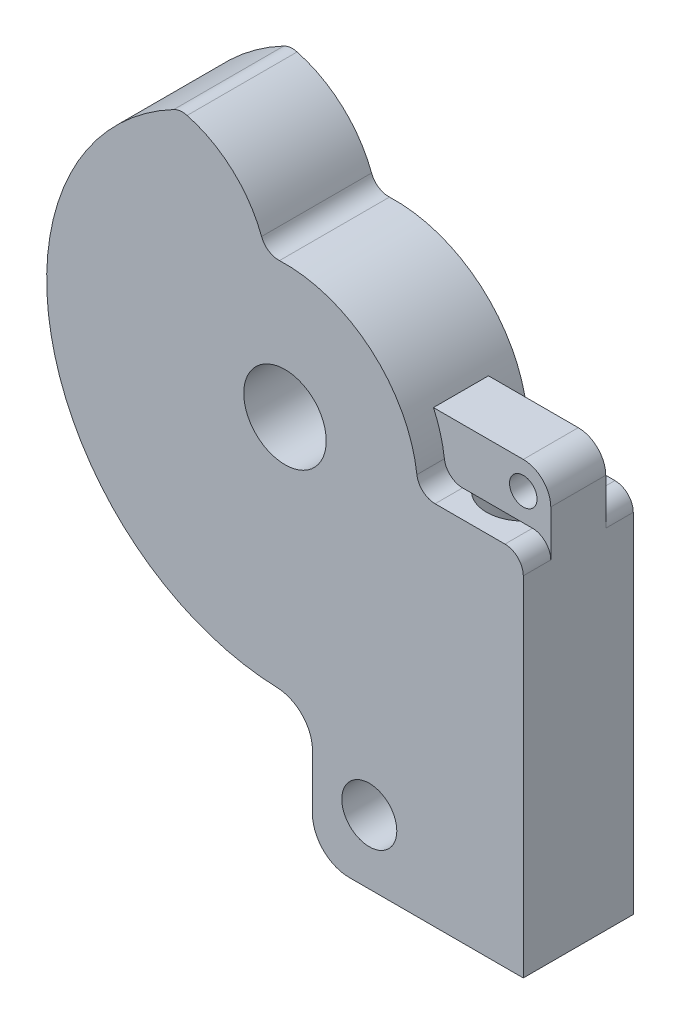
ISO-10303-21;
HEADER;
FILE_DESCRIPTION(('STEP AP214'),'2;1');
FILE_NAME('part.step','',(''),(''),'','','');
FILE_SCHEMA(('AUTOMOTIVE_DESIGN { 1 0 10303 214 1 1 1 1 }'));
ENDSEC;
DATA;
#1=APPLICATION_CONTEXT('core data for automotive mechanical design processes');
#2=APPLICATION_PROTOCOL_DEFINITION('international standard','automotive_design',2000,#1);
#3=PRODUCT_CONTEXT('',#1,'mechanical');
#4=PRODUCT('Part','Part','',(#3));
#5=PRODUCT_RELATED_PRODUCT_CATEGORY('part','',(#4));
#6=PRODUCT_DEFINITION_FORMATION('','',#4);
#7=PRODUCT_DEFINITION_CONTEXT('part definition',#1,'design');
#8=PRODUCT_DEFINITION('design','',#6,#7);
#9=PRODUCT_DEFINITION_SHAPE('','',#8);
#10=(LENGTH_UNIT() NAMED_UNIT(*) SI_UNIT(.MILLI.,.METRE.));
#11=(NAMED_UNIT(*) PLANE_ANGLE_UNIT() SI_UNIT($,.RADIAN.));
#12=(NAMED_UNIT(*) SI_UNIT($,.STERADIAN.) SOLID_ANGLE_UNIT());
#13=UNCERTAINTY_MEASURE_WITH_UNIT(LENGTH_MEASURE(1.E-05),#10,'distance_accuracy_value','');
#14=(GEOMETRIC_REPRESENTATION_CONTEXT(3) GLOBAL_UNCERTAINTY_ASSIGNED_CONTEXT((#13)) GLOBAL_UNIT_ASSIGNED_CONTEXT((#10,
#11,#12)) REPRESENTATION_CONTEXT('',''));
#15=CARTESIAN_POINT('',(0.,0.,0.));
#16=DIRECTION('',(0.,0.,1.));
#17=DIRECTION('',(1.,0.,0.));
#18=AXIS2_PLACEMENT_3D('',#15,#16,#17);
#19=CARTESIAN_POINT('',(13.,0.,-3.));
#20=DIRECTION('',(0.,-1.,0.));
#21=DIRECTION('',(1.,0.,0.));
#22=AXIS2_PLACEMENT_3D('',#19,#20,#21);
#23=PLANE('',#22);
#24=DIRECTION('',(1.,0.,0.));
#25=VECTOR('',#24,1.);
#26=CARTESIAN_POINT('',(7.25,0.,-1.5));
#27=LINE('',#26,#25);
#28=CARTESIAN_POINT('',(11.3228756555323,0.,-1.5));
#29=VERTEX_POINT('',#28);
#30=CARTESIAN_POINT('',(12.,0.,-1.5));
#31=VERTEX_POINT('',#30);
#32=EDGE_CURVE('E228',#29,#31,#27,.T.);
#33=ORIENTED_EDGE('',*,*,#32,.T.);
#34=DIRECTION('',(0.,0.,-1.));
#35=VECTOR('',#34,1.);
#36=CARTESIAN_POINT('',(12.,0.,-3.));
#37=LINE('',#36,#35);
#38=CARTESIAN_POINT('',(12.,0.,-3.));
#39=VERTEX_POINT('',#38);
#40=EDGE_CURVE('E303',#31,#39,#37,.T.);
#41=ORIENTED_EDGE('',*,*,#40,.T.);
#42=DIRECTION('',(1.,0.,0.));
#43=VECTOR('',#42,1.);
#44=CARTESIAN_POINT('',(13.,0.,-3.));
#45=LINE('',#44,#43);
#46=CARTESIAN_POINT('',(8.1891696770796,0.,-3.));
#47=VERTEX_POINT('',#46);
#48=EDGE_CURVE('E252',#47,#39,#45,.T.);
#49=ORIENTED_EDGE('',*,*,#48,.F.);
#50=DIRECTION('',(0.,0.,-1.));
#51=VECTOR('',#50,1.);
#52=CARTESIAN_POINT('',(8.1891696770796,0.,-1.5));
#53=LINE('',#52,#51);
#54=CARTESIAN_POINT('',(8.1891696770796,0.,-1.5));
#55=VERTEX_POINT('',#54);
#56=EDGE_CURVE('E300',#47,#55,#53,.F.);
#57=ORIENTED_EDGE('',*,*,#56,.T.);
#58=CARTESIAN_POINT('',(8.67712434446771,0.,-1.5));
#59=VERTEX_POINT('',#58);
#60=EDGE_CURVE('E230',#55,#59,#27,.T.);
#61=ORIENTED_EDGE('',*,*,#60,.T.);
#62=CARTESIAN_POINT('',(10.,0.,0.));
#63=DIRECTION('',(0.,-1.,0.));
#64=DIRECTION('',(1.,0.,0.));
#65=AXIS2_PLACEMENT_3D('',#62,#63,#64);
#66=CIRCLE('',#65,2.);
#67=EDGE_CURVE('E264',#29,#59,#66,.F.);
#68=ORIENTED_EDGE('',*,*,#67,.F.);
#69=EDGE_LOOP('',(#33,#41,#49,#57,#61,#68));
#70=FACE_BOUND('',#69,.T.);
#71=ADVANCED_FACE('F42',(#70),#23,.F.);
#72=CARTESIAN_POINT('',(0.,0.,3.));
#73=DIRECTION('',(0.,0.,1.));
#74=DIRECTION('',(1.,0.,0.));
#75=AXIS2_PLACEMENT_3D('',#72,#73,#74);
#76=PLANE('',#75);
#77=CARTESIAN_POINT('',(0.,0.,3.));
#78=DIRECTION('',(0.,0.,1.));
#79=DIRECTION('',(1.,0.,0.));
#80=AXIS2_PLACEMENT_3D('',#77,#78,#79);
#81=CIRCLE('',#80,2.25);
#82=CARTESIAN_POINT('',(2.25,0.,3.));
#83=VERTEX_POINT('',#82);
#84=EDGE_CURVE('E276',#83,#83,#81,.T.);
#85=ORIENTED_EDGE('',*,*,#84,.F.);
#86=EDGE_LOOP('',(#85));
#87=FACE_BOUND('',#86,.T.);
#88=DIRECTION('',(0.,1.,0.));
#89=VECTOR('',#88,1.);
#90=CARTESIAN_POINT('',(1.5,-20.,3.));
#91=LINE('',#90,#89);
#92=CARTESIAN_POINT('',(1.5,-18.,3.));
#93=VERTEX_POINT('',#92);
#94=CARTESIAN_POINT('',(1.5,-14.9916643505649,3.));
#95=VERTEX_POINT('',#94);
#96=EDGE_CURVE('E388',#93,#95,#91,.T.);
#97=ORIENTED_EDGE('',*,*,#96,.F.);
#98=CARTESIAN_POINT('',(3.5,-18.,3.));
#99=DIRECTION('',(0.,0.,1.));
#100=DIRECTION('',(1.,0.,0.));
#101=AXIS2_PLACEMENT_3D('',#98,#99,#100);
#102=CIRCLE('',#101,2.);
#103=CARTESIAN_POINT('',(3.5,-20.,3.));
#104=VERTEX_POINT('',#103);
#105=EDGE_CURVE('E57',#93,#104,#102,.T.);
#106=ORIENTED_EDGE('',*,*,#105,.T.);
#107=DIRECTION('',(1.,0.,0.));
#108=VECTOR('',#107,1.);
#109=CARTESIAN_POINT('',(13.,-20.,3.));
#110=LINE('',#109,#108);
#111=CARTESIAN_POINT('',(13.,-20.,3.));
#112=VERTEX_POINT('',#111);
#113=EDGE_CURVE('E286',#104,#112,#110,.T.);
#114=ORIENTED_EDGE('',*,*,#113,.T.);
#115=DIRECTION('',(0.,1.,0.));
#116=VECTOR('',#115,1.);
#117=CARTESIAN_POINT('',(13.,0.,3.));
#118=LINE('',#117,#116);
#119=CARTESIAN_POINT('',(13.,-0.999999999999997,3.));
#120=VERTEX_POINT('',#119);
#121=EDGE_CURVE('E289',#112,#120,#118,.T.);
#122=ORIENTED_EDGE('',*,*,#121,.T.);
#123=CARTESIAN_POINT('',(12.,-0.999999999999997,3.));
#124=DIRECTION('',(0.,0.,1.));
#125=DIRECTION('',(1.,0.,0.));
#126=AXIS2_PLACEMENT_3D('',#123,#124,#125);
#127=CIRCLE('',#126,1.);
#128=CARTESIAN_POINT('',(12.,0.,3.));
#129=VERTEX_POINT('',#128);
#130=EDGE_CURVE('E331',#120,#129,#127,.T.);
#131=ORIENTED_EDGE('',*,*,#130,.T.);
#132=DIRECTION('',(1.,0.,0.));
#133=VECTOR('',#132,1.);
#134=CARTESIAN_POINT('',(13.,0.,3.));
#135=LINE('',#134,#133);
#136=CARTESIAN_POINT('',(8.1891696770796,0.,3.));
#137=VERTEX_POINT('',#136);
#138=EDGE_CURVE('E249',#137,#129,#135,.T.);
#139=ORIENTED_EDGE('',*,*,#138,.F.);
#140=CARTESIAN_POINT('',(8.1891696770796,1.,3.));
#141=DIRECTION('',(0.,0.,1.));
#142=DIRECTION('',(1.,0.,0.));
#143=AXIS2_PLACEMENT_3D('',#140,#141,#142);
#144=CIRCLE('',#143,1.);
#145=CARTESIAN_POINT('',(7.1965430495548,0.878787878787879,3.));
#146=VERTEX_POINT('',#145);
#147=EDGE_CURVE('E344',#137,#146,#144,.F.);
#148=ORIENTED_EDGE('',*,*,#147,.T.);
#149=CARTESIAN_POINT('',(0.,0.,3.));
#150=DIRECTION('',(0.,0.,-1.));
#151=DIRECTION('',(1.,0.,0.));
#152=AXIS2_PLACEMENT_3D('',#149,#150,#151);
#153=CIRCLE('',#152,7.25);
#154=CARTESIAN_POINT('',(-0.29888319315225,7.24383661030887,3.));
#155=VERTEX_POINT('',#154);
#156=EDGE_CURVE('E259',#155,#146,#153,.T.);
#157=ORIENTED_EDGE('',*,*,#156,.F.);
#158=CARTESIAN_POINT('',(-0.34010846117325,8.24298648759285,3.));
#159=DIRECTION('',(0.,0.,1.));
#160=DIRECTION('',(1.,0.,0.));
#161=AXIS2_PLACEMENT_3D('',#158,#159,#160);
#162=CIRCLE('',#161,1.);
#163=CARTESIAN_POINT('',(-1.27643582215861,7.89185820181943,3.));
#164=VERTEX_POINT('',#163);
#165=EDGE_CURVE('E349',#155,#164,#162,.F.);
#166=ORIENTED_EDGE('',*,*,#165,.T.);
#167=CARTESIAN_POINT('',(-6.89439998807079,5.78508848717886,3.));
#168=DIRECTION('',(0.,0.,-1.));
#169=DIRECTION('',(1.,0.,0.));
#170=AXIS2_PLACEMENT_3D('',#167,#168,#169);
#171=CIRCLE('',#170,6.);
#172=CARTESIAN_POINT('',(-5.33895357475905,11.5799643663773,3.));
#173=VERTEX_POINT('',#172);
#174=EDGE_CURVE('E256',#173,#164,#171,.T.);
#175=ORIENTED_EDGE('',*,*,#174,.F.);
#176=CARTESIAN_POINT('',(-5.59819464364434,10.6141517198442,3.));
#177=DIRECTION('',(0.,0.,1.));
#178=DIRECTION('',(1.,0.,0.));
#179=AXIS2_PLACEMENT_3D('',#176,#177,#178);
#180=CIRCLE('',#179,1.);
#181=CARTESIAN_POINT('',(-6.06471086394803,11.4986643631646,3.));
#182=VERTEX_POINT('',#181);
#183=EDGE_CURVE('E329',#173,#182,#180,.T.);
#184=ORIENTED_EDGE('',*,*,#183,.T.);
#185=CARTESIAN_POINT('',(0.,0.,3.));
#186=DIRECTION('',(0.,0.,1.));
#187=DIRECTION('',(1.,0.,0.));
#188=AXIS2_PLACEMENT_3D('',#185,#186,#187);
#189=CIRCLE('',#188,13.);
#190=CARTESIAN_POINT('',(-0.433333333333332,-12.9927757704896,3.));
#191=VERTEX_POINT('',#190);
#192=EDGE_CURVE('E283',#182,#191,#189,.T.);
#193=ORIENTED_EDGE('',*,*,#192,.T.);
#194=CARTESIAN_POINT('',(-0.499999999999999,-14.9916643505649,3.));
#195=DIRECTION('',(0.,0.,1.));
#196=DIRECTION('',(1.,0.,0.));
#197=AXIS2_PLACEMENT_3D('',#194,#195,#196);
#198=CIRCLE('',#197,2.);
#199=EDGE_CURVE('E13',#191,#95,#198,.F.);
#200=ORIENTED_EDGE('',*,*,#199,.T.);
#201=EDGE_LOOP('',(#97,#106,#114,#122,#131,#139,#148,#157,#166,#175,#184,#193,#200));
#202=FACE_BOUND('',#201,.T.);
#203=CARTESIAN_POINT('',(4.6,-16.5,3.));
#204=DIRECTION('',(0.,0.,1.));
#205=DIRECTION('',(1.,0.,0.));
#206=AXIS2_PLACEMENT_3D('',#203,#204,#205);
#207=CIRCLE('',#206,1.5);
#208=CARTESIAN_POINT('',(6.1,-16.5,3.));
#209=VERTEX_POINT('',#208);
#210=EDGE_CURVE('E357',#209,#209,#207,.F.);
#211=ORIENTED_EDGE('',*,*,#210,.T.);
#212=EDGE_LOOP('',(#211));
#213=FACE_BOUND('',#212,.T.);
#214=ADVANCED_FACE('F386',(#87,#202,#213),#76,.T.);
#215=CARTESIAN_POINT('',(0.,0.,-3.));
#216=DIRECTION('',(0.,0.,1.));
#217=DIRECTION('',(1.,0.,0.));
#218=AXIS2_PLACEMENT_3D('',#215,#216,#217);
#219=PLANE('',#218);
#220=CARTESIAN_POINT('',(-6.89439998807079,5.78508848717886,-3.));
#221=DIRECTION('',(0.,0.,1.));
#222=DIRECTION('',(1.,0.,0.));
#223=AXIS2_PLACEMENT_3D('',#220,#221,#222);
#224=CIRCLE('',#223,3.);
#225=CARTESIAN_POINT('',(-3.89439998807079,5.78508848717886,-3.));
#226=VERTEX_POINT('',#225);
#227=EDGE_CURVE('E267',#226,#226,#224,.T.);
#228=ORIENTED_EDGE('',*,*,#227,.T.);
#229=EDGE_LOOP('',(#228));
#230=FACE_BOUND('',#229,.T.);
#231=CARTESIAN_POINT('',(0.,0.,-3.));
#232=DIRECTION('',(0.,0.,1.));
#233=DIRECTION('',(1.,0.,0.));
#234=AXIS2_PLACEMENT_3D('',#231,#232,#233);
#235=CIRCLE('',#234,2.25);
#236=CARTESIAN_POINT('',(2.25,0.,-3.));
#237=VERTEX_POINT('',#236);
#238=EDGE_CURVE('E279',#237,#237,#235,.T.);
#239=ORIENTED_EDGE('',*,*,#238,.T.);
#240=EDGE_LOOP('',(#239));
#241=FACE_BOUND('',#240,.T.);
#242=DIRECTION('',(1.,0.,0.));
#243=VECTOR('',#242,1.);
#244=CARTESIAN_POINT('',(13.,-20.,-3.));
#245=LINE('',#244,#243);
#246=CARTESIAN_POINT('',(3.5,-20.,-3.));
#247=VERTEX_POINT('',#246);
#248=CARTESIAN_POINT('',(13.,-20.,-3.));
#249=VERTEX_POINT('',#248);
#250=EDGE_CURVE('E295',#247,#249,#245,.T.);
#251=ORIENTED_EDGE('',*,*,#250,.F.);
#252=CARTESIAN_POINT('',(3.5,-18.,-3.));
#253=DIRECTION('',(0.,0.,1.));
#254=DIRECTION('',(1.,0.,0.));
#255=AXIS2_PLACEMENT_3D('',#252,#253,#254);
#256=CIRCLE('',#255,2.);
#257=CARTESIAN_POINT('',(1.5,-18.,-3.));
#258=VERTEX_POINT('',#257);
#259=EDGE_CURVE('E65',#247,#258,#256,.F.);
#260=ORIENTED_EDGE('',*,*,#259,.T.);
#261=DIRECTION('',(0.,1.,0.));
#262=VECTOR('',#261,1.);
#263=CARTESIAN_POINT('',(1.5,-20.,-3.));
#264=LINE('',#263,#262);
#265=CARTESIAN_POINT('',(1.5,-14.9916643505649,-3.));
#266=VERTEX_POINT('',#265);
#267=EDGE_CURVE('E375',#258,#266,#264,.T.);
#268=ORIENTED_EDGE('',*,*,#267,.T.);
#269=CARTESIAN_POINT('',(-0.499999999999999,-14.9916643505649,-3.));
#270=DIRECTION('',(0.,0.,1.));
#271=DIRECTION('',(1.,0.,0.));
#272=AXIS2_PLACEMENT_3D('',#269,#270,#271);
#273=CIRCLE('',#272,2.);
#274=CARTESIAN_POINT('',(-0.433333333333332,-12.9927757704896,-3.));
#275=VERTEX_POINT('',#274);
#276=EDGE_CURVE('E50',#266,#275,#273,.T.);
#277=ORIENTED_EDGE('',*,*,#276,.T.);
#278=CARTESIAN_POINT('',(0.,0.,-3.));
#279=DIRECTION('',(0.,0.,1.));
#280=DIRECTION('',(1.,0.,0.));
#281=AXIS2_PLACEMENT_3D('',#278,#279,#280);
#282=CIRCLE('',#281,13.);
#283=CARTESIAN_POINT('',(-6.06471086394803,11.4986643631646,-3.));
#284=VERTEX_POINT('',#283);
#285=EDGE_CURVE('E282',#284,#275,#282,.T.);
#286=ORIENTED_EDGE('',*,*,#285,.F.);
#287=CARTESIAN_POINT('',(-5.59819464364434,10.6141517198442,-3.));
#288=DIRECTION('',(0.,0.,1.));
#289=DIRECTION('',(1.,0.,0.));
#290=AXIS2_PLACEMENT_3D('',#287,#288,#289);
#291=CIRCLE('',#290,1.);
#292=CARTESIAN_POINT('',(-5.33895357475905,11.5799643663773,-3.));
#293=VERTEX_POINT('',#292);
#294=EDGE_CURVE('E306',#284,#293,#291,.F.);
#295=ORIENTED_EDGE('',*,*,#294,.T.);
#296=CARTESIAN_POINT('',(-6.89439998807079,5.78508848717886,-3.));
#297=DIRECTION('',(0.,0.,-1.));
#298=DIRECTION('',(1.,0.,0.));
#299=AXIS2_PLACEMENT_3D('',#296,#297,#298);
#300=CIRCLE('',#299,6.);
#301=CARTESIAN_POINT('',(-1.27643582215861,7.89185820181943,-3.));
#302=VERTEX_POINT('',#301);
#303=EDGE_CURVE('E245',#293,#302,#300,.T.);
#304=ORIENTED_EDGE('',*,*,#303,.T.);
#305=CARTESIAN_POINT('',(-0.34010846117325,8.24298648759285,-3.));
#306=DIRECTION('',(0.,0.,1.));
#307=DIRECTION('',(1.,0.,0.));
#308=AXIS2_PLACEMENT_3D('',#305,#306,#307);
#309=CIRCLE('',#308,1.);
#310=CARTESIAN_POINT('',(-0.29888319315225,7.24383661030887,-3.));
#311=VERTEX_POINT('',#310);
#312=EDGE_CURVE('E351',#302,#311,#309,.T.);
#313=ORIENTED_EDGE('',*,*,#312,.T.);
#314=CARTESIAN_POINT('',(0.,0.,-3.));
#315=DIRECTION('',(0.,0.,-1.));
#316=DIRECTION('',(1.,0.,0.));
#317=AXIS2_PLACEMENT_3D('',#314,#315,#316);
#318=CIRCLE('',#317,7.25);
#319=CARTESIAN_POINT('',(7.1965430495548,0.878787878787879,-3.));
#320=VERTEX_POINT('',#319);
#321=EDGE_CURVE('E248',#311,#320,#318,.T.);
#322=ORIENTED_EDGE('',*,*,#321,.T.);
#323=CARTESIAN_POINT('',(8.1891696770796,1.,-3.));
#324=DIRECTION('',(0.,0.,1.));
#325=DIRECTION('',(1.,0.,0.));
#326=AXIS2_PLACEMENT_3D('',#323,#324,#325);
#327=CIRCLE('',#326,1.);
#328=EDGE_CURVE('E347',#320,#47,#327,.T.);
#329=ORIENTED_EDGE('',*,*,#328,.T.);
#330=ORIENTED_EDGE('',*,*,#48,.T.);
#331=CARTESIAN_POINT('',(12.,-0.999999999999997,-3.));
#332=DIRECTION('',(0.,0.,1.));
#333=DIRECTION('',(1.,0.,0.));
#334=AXIS2_PLACEMENT_3D('',#331,#332,#333);
#335=CIRCLE('',#334,1.);
#336=CARTESIAN_POINT('',(13.,-0.999999999999997,-3.));
#337=VERTEX_POINT('',#336);
#338=EDGE_CURVE('E308',#39,#337,#335,.F.);
#339=ORIENTED_EDGE('',*,*,#338,.T.);
#340=DIRECTION('',(0.,1.,0.));
#341=VECTOR('',#340,1.);
#342=CARTESIAN_POINT('',(13.,0.,-3.));
#343=LINE('',#342,#341);
#344=EDGE_CURVE('E287',#249,#337,#343,.T.);
#345=ORIENTED_EDGE('',*,*,#344,.F.);
#346=EDGE_LOOP('',(#251,#260,#268,#277,#286,#295,#304,#313,#322,#329,#330,#339,#345));
#347=FACE_BOUND('',#346,.T.);
#348=CARTESIAN_POINT('',(4.6,-16.5,-3.));
#349=DIRECTION('',(0.,0.,-1.));
#350=DIRECTION('',(-1.,0.,0.));
#351=AXIS2_PLACEMENT_3D('',#348,#349,#350);
#352=CIRCLE('',#351,1.5);
#353=CARTESIAN_POINT('',(3.1,-16.5,-3.));
#354=VERTEX_POINT('',#353);
#355=EDGE_CURVE('E391',#354,#354,#352,.T.);
#356=ORIENTED_EDGE('',*,*,#355,.F.);
#357=EDGE_LOOP('',(#356));
#358=FACE_BOUND('',#357,.T.);
#359=ADVANCED_FACE('F371',(#230,#241,#347,#358),#219,.F.);
#360=CARTESIAN_POINT('',(0.,0.,3.));
#361=DIRECTION('',(0.,0.,-1.));
#362=DIRECTION('',(-1.,0.,0.));
#363=AXIS2_PLACEMENT_3D('',#360,#361,#362);
#364=CYLINDRICAL_SURFACE('',#363,13.);
#365=ORIENTED_EDGE('',*,*,#285,.T.);
#366=DIRECTION('',(0.,0.,-1.));
#367=VECTOR('',#366,1.);
#368=CARTESIAN_POINT('',(-0.433333333333332,-12.9927757704896,3.));
#369=LINE('',#368,#367);
#370=EDGE_CURVE('E362',#275,#191,#369,.F.);
#371=ORIENTED_EDGE('',*,*,#370,.T.);
#372=ORIENTED_EDGE('',*,*,#192,.F.);
#373=DIRECTION('',(0.,0.,-1.));
#374=VECTOR('',#373,1.);
#375=CARTESIAN_POINT('',(-6.06471086394803,11.4986643631646,3.));
#376=LINE('',#375,#374);
#377=EDGE_CURVE('E340',#182,#284,#376,.T.);
#378=ORIENTED_EDGE('',*,*,#377,.T.);
#379=EDGE_LOOP('',(#365,#371,#372,#378));
#380=FACE_BOUND('',#379,.T.);
#381=ADVANCED_FACE('F380',(#380),#364,.T.);
#382=CARTESIAN_POINT('',(13.,-20.,3.));
#383=DIRECTION('',(0.,1.,0.));
#384=DIRECTION('',(0.,0.,1.));
#385=AXIS2_PLACEMENT_3D('',#382,#383,#384);
#386=PLANE('',#385);
#387=CARTESIAN_POINT('',(10.,-20.,0.));
#388=DIRECTION('',(0.,-1.,0.));
#389=DIRECTION('',(0.,0.,-1.));
#390=AXIS2_PLACEMENT_3D('',#387,#388,#389);
#391=CIRCLE('',#390,2.);
#392=CARTESIAN_POINT('',(10.,-20.,-2.));
#393=VERTEX_POINT('',#392);
#394=EDGE_CURVE('E273',#393,#393,#391,.T.);
#395=ORIENTED_EDGE('',*,*,#394,.F.);
#396=EDGE_LOOP('',(#395));
#397=FACE_BOUND('',#396,.T.);
#398=ORIENTED_EDGE('',*,*,#113,.F.);
#399=DIRECTION('',(0.,0.,-1.));
#400=VECTOR('',#399,1.);
#401=CARTESIAN_POINT('',(3.5,-20.,-3.));
#402=LINE('',#401,#400);
#403=EDGE_CURVE('E364',#104,#247,#402,.T.);
#404=ORIENTED_EDGE('',*,*,#403,.T.);
#405=ORIENTED_EDGE('',*,*,#250,.T.);
#406=DIRECTION('',(0.,0.,-1.));
#407=VECTOR('',#406,1.);
#408=CARTESIAN_POINT('',(13.,-20.,3.));
#409=LINE('',#408,#407);
#410=EDGE_CURVE('E292',#112,#249,#409,.T.);
#411=ORIENTED_EDGE('',*,*,#410,.F.);
#412=EDGE_LOOP('',(#398,#404,#405,#411));
#413=FACE_BOUND('',#412,.T.);
#414=ADVANCED_FACE('F434',(#397,#413),#386,.F.);
#415=CARTESIAN_POINT('',(13.,0.,3.));
#416=DIRECTION('',(-1.,0.,0.));
#417=DIRECTION('',(0.,-1.,0.));
#418=AXIS2_PLACEMENT_3D('',#415,#416,#417);
#419=PLANE('',#418);
#420=ORIENTED_EDGE('',*,*,#344,.T.);
#421=DIRECTION('',(0.,0.,-1.));
#422=VECTOR('',#421,1.);
#423=CARTESIAN_POINT('',(13.,-0.999999999999997,3.));
#424=LINE('',#423,#422);
#425=CARTESIAN_POINT('',(13.,-0.999999999999997,-1.5));
#426=VERTEX_POINT('',#425);
#427=EDGE_CURVE('E312',#337,#426,#424,.F.);
#428=ORIENTED_EDGE('',*,*,#427,.T.);
#429=DIRECTION('',(0.,1.,0.));
#430=VECTOR('',#429,1.);
#431=CARTESIAN_POINT('',(13.,1.5,-1.5));
#432=LINE('',#431,#430);
#433=CARTESIAN_POINT('',(13.,1.5,-1.5));
#434=VERTEX_POINT('',#433);
#435=EDGE_CURVE('E210',#426,#434,#432,.T.);
#436=ORIENTED_EDGE('',*,*,#435,.T.);
#437=DIRECTION('',(0.,0.,-1.));
#438=VECTOR('',#437,1.);
#439=CARTESIAN_POINT('',(13.,1.5,1.5));
#440=LINE('',#439,#438);
#441=CARTESIAN_POINT('',(13.,1.5,1.5));
#442=VERTEX_POINT('',#441);
#443=EDGE_CURVE('E206',#442,#434,#440,.T.);
#444=ORIENTED_EDGE('',*,*,#443,.F.);
#445=DIRECTION('',(0.,1.,0.));
#446=VECTOR('',#445,1.);
#447=CARTESIAN_POINT('',(13.,1.5,1.5));
#448=LINE('',#447,#446);
#449=CARTESIAN_POINT('',(13.,-0.999999999999997,1.5));
#450=VERTEX_POINT('',#449);
#451=EDGE_CURVE('E191',#450,#442,#448,.T.);
#452=ORIENTED_EDGE('',*,*,#451,.F.);
#453=DIRECTION('',(0.,0.,-1.));
#454=VECTOR('',#453,1.);
#455=CARTESIAN_POINT('',(13.,-0.999999999999997,3.));
#456=LINE('',#455,#454);
#457=EDGE_CURVE('E310',#450,#120,#456,.F.);
#458=ORIENTED_EDGE('',*,*,#457,.T.);
#459=ORIENTED_EDGE('',*,*,#121,.F.);
#460=ORIENTED_EDGE('',*,*,#410,.T.);
#461=EDGE_LOOP('',(#420,#428,#436,#444,#452,#458,#459,#460));
#462=FACE_BOUND('',#461,.T.);
#463=ADVANCED_FACE('F208',(#462),#419,.F.);
#464=CARTESIAN_POINT('',(0.,0.,3.));
#465=DIRECTION('',(0.,0.,1.));
#466=DIRECTION('',(1.,0.,0.));
#467=AXIS2_PLACEMENT_3D('',#464,#465,#466);
#468=CYLINDRICAL_SURFACE('',#467,2.25);
#469=ORIENTED_EDGE('',*,*,#238,.F.);
#470=EDGE_LOOP('',(#469));
#471=FACE_BOUND('',#470,.T.);
#472=ORIENTED_EDGE('',*,*,#84,.T.);
#473=EDGE_LOOP('',(#472));
#474=FACE_BOUND('',#473,.T.);
#475=ADVANCED_FACE('F472',(#471,#474),#468,.F.);
#476=CARTESIAN_POINT('',(10.,0.,0.));
#477=DIRECTION('',(0.,-1.,0.));
#478=DIRECTION('',(0.,0.,-1.));
#479=AXIS2_PLACEMENT_3D('',#476,#477,#478);
#480=CYLINDRICAL_SURFACE('',#479,2.);
#481=ORIENTED_EDGE('',*,*,#67,.T.);
#482=CARTESIAN_POINT('',(10.,0.,0.));
#483=DIRECTION('',(0.,1.,0.));
#484=DIRECTION('',(-1.,0.,0.));
#485=AXIS2_PLACEMENT_3D('',#482,#483,#484);
#486=CIRCLE('',#485,2.);
#487=CARTESIAN_POINT('',(8.6771243444677,0.,1.5));
#488=VERTEX_POINT('',#487);
#489=EDGE_CURVE('E213',#488,#59,#486,.F.);
#490=ORIENTED_EDGE('',*,*,#489,.F.);
#491=CARTESIAN_POINT('',(11.3228756555323,0.,1.5));
#492=VERTEX_POINT('',#491);
#493=EDGE_CURVE('E255',#488,#492,#66,.F.);
#494=ORIENTED_EDGE('',*,*,#493,.T.);
#495=EDGE_CURVE('E244',#29,#492,#486,.F.);
#496=ORIENTED_EDGE('',*,*,#495,.F.);
#497=EDGE_LOOP('',(#481,#490,#494,#496));
#498=FACE_BOUND('',#497,.T.);
#499=ORIENTED_EDGE('',*,*,#394,.T.);
#500=EDGE_LOOP('',(#499));
#501=FACE_BOUND('',#500,.T.);
#502=ADVANCED_FACE('F413',(#498,#501),#480,.F.);
#503=CARTESIAN_POINT('',(-6.89439998807079,5.78508848717886,11.4852813742386));
#504=DIRECTION('',(0.,0.,-1.));
#505=DIRECTION('',(-1.,0.,0.));
#506=AXIS2_PLACEMENT_3D('',#503,#504,#505);
#507=CYLINDRICAL_SURFACE('',#506,3.);
#508=ORIENTED_EDGE('',*,*,#227,.F.);
#509=EDGE_LOOP('',(#508));
#510=FACE_BOUND('',#509,.T.);
#511=CARTESIAN_POINT('',(-6.89439998807079,5.78508848717886,1.4));
#512=DIRECTION('',(0.,0.,1.));
#513=DIRECTION('',(1.,0.,0.));
#514=AXIS2_PLACEMENT_3D('',#511,#512,#513);
#515=CIRCLE('',#514,3.);
#516=CARTESIAN_POINT('',(-3.89439998807079,5.78508848717886,1.4));
#517=VERTEX_POINT('',#516);
#518=EDGE_CURVE('E270',#517,#517,#515,.T.);
#519=ORIENTED_EDGE('',*,*,#518,.T.);
#520=EDGE_LOOP('',(#519));
#521=FACE_BOUND('',#520,.T.);
#522=ADVANCED_FACE('F459',(#510,#521),#507,.F.);
#523=CARTESIAN_POINT('',(0.,0.,1.4));
#524=DIRECTION('',(0.,0.,1.));
#525=DIRECTION('',(1.,0.,0.));
#526=AXIS2_PLACEMENT_3D('',#523,#524,#525);
#527=PLANE('',#526);
#528=ORIENTED_EDGE('',*,*,#518,.F.);
#529=EDGE_LOOP('',(#528));
#530=FACE_BOUND('',#529,.T.);
#531=ADVANCED_FACE('F452',(#530),#527,.F.);
#532=DIRECTION('',(1.,0.,0.));
#533=VECTOR('',#532,1.);
#534=CARTESIAN_POINT('',(7.25,0.,1.5));
#535=LINE('',#534,#533);
#536=CARTESIAN_POINT('',(8.1891696770796,0.,1.5));
#537=VERTEX_POINT('',#536);
#538=EDGE_CURVE('E203',#537,#488,#535,.T.);
#539=ORIENTED_EDGE('',*,*,#538,.F.);
#540=DIRECTION('',(0.,0.,-1.));
#541=VECTOR('',#540,1.);
#542=CARTESIAN_POINT('',(8.1891696770796,0.,3.));
#543=LINE('',#542,#541);
#544=EDGE_CURVE('E317',#537,#137,#543,.F.);
#545=ORIENTED_EDGE('',*,*,#544,.T.);
#546=ORIENTED_EDGE('',*,*,#138,.T.);
#547=DIRECTION('',(0.,0.,-1.));
#548=VECTOR('',#547,1.);
#549=CARTESIAN_POINT('',(12.,0.,-3.));
#550=LINE('',#549,#548);
#551=CARTESIAN_POINT('',(12.,0.,1.5));
#552=VERTEX_POINT('',#551);
#553=EDGE_CURVE('E314',#129,#552,#550,.T.);
#554=ORIENTED_EDGE('',*,*,#553,.T.);
#555=EDGE_CURVE('E399',#492,#552,#535,.T.);
#556=ORIENTED_EDGE('',*,*,#555,.F.);
#557=ORIENTED_EDGE('',*,*,#493,.F.);
#558=EDGE_LOOP('',(#539,#545,#546,#554,#556,#557));
#559=FACE_BOUND('',#558,.T.);
#560=ADVANCED_FACE('F407',(#559),#23,.F.);
#561=CARTESIAN_POINT('',(0.,0.,-3.));
#562=DIRECTION('',(0.,0.,1.));
#563=DIRECTION('',(1.,0.,0.));
#564=AXIS2_PLACEMENT_3D('',#561,#562,#563);
#565=CYLINDRICAL_SURFACE('',#564,7.25);
#566=ORIENTED_EDGE('',*,*,#156,.T.);
#567=DIRECTION('',(0.,0.,1.));
#568=VECTOR('',#567,1.);
#569=CARTESIAN_POINT('',(7.1965430495548,0.878787878787878,-3.));
#570=LINE('',#569,#568);
#571=CARTESIAN_POINT('',(7.1965430495548,0.878787878787879,1.5));
#572=VERTEX_POINT('',#571);
#573=EDGE_CURVE('E325',#146,#572,#570,.F.);
#574=ORIENTED_EDGE('',*,*,#573,.T.);
#575=CARTESIAN_POINT('',(0.,0.,1.5));
#576=DIRECTION('',(0.,0.,-1.));
#577=DIRECTION('',(1.,0.,0.));
#578=AXIS2_PLACEMENT_3D('',#575,#576,#577);
#579=CIRCLE('',#578,7.25);
#580=CARTESIAN_POINT('',(6.60018939122204,3.,1.5));
#581=VERTEX_POINT('',#580);
#582=EDGE_CURVE('E239',#581,#572,#579,.T.);
#583=ORIENTED_EDGE('',*,*,#582,.F.);
#584=DIRECTION('',(0.,0.,-1.));
#585=VECTOR('',#584,1.);
#586=CARTESIAN_POINT('',(6.60018939122204,3.,1.5));
#587=LINE('',#586,#585);
#588=CARTESIAN_POINT('',(6.60018939122204,3.,-1.5));
#589=VERTEX_POINT('',#588);
#590=EDGE_CURVE('E221',#581,#589,#587,.T.);
#591=ORIENTED_EDGE('',*,*,#590,.T.);
#592=CARTESIAN_POINT('',(0.,0.,-1.5));
#593=DIRECTION('',(0.,0.,-1.));
#594=DIRECTION('',(1.,0.,0.));
#595=AXIS2_PLACEMENT_3D('',#592,#593,#594);
#596=CIRCLE('',#595,7.25);
#597=CARTESIAN_POINT('',(7.1965430495548,0.878787878787879,-1.5));
#598=VERTEX_POINT('',#597);
#599=EDGE_CURVE('E225',#589,#598,#596,.T.);
#600=ORIENTED_EDGE('',*,*,#599,.T.);
#601=DIRECTION('',(0.,0.,1.));
#602=VECTOR('',#601,1.);
#603=CARTESIAN_POINT('',(7.1965430495548,0.878787878787878,-3.));
#604=LINE('',#603,#602);
#605=EDGE_CURVE('E323',#598,#320,#604,.F.);
#606=ORIENTED_EDGE('',*,*,#605,.T.);
#607=ORIENTED_EDGE('',*,*,#321,.F.);
#608=DIRECTION('',(0.,0.,1.));
#609=VECTOR('',#608,1.);
#610=CARTESIAN_POINT('',(-0.29888319315225,7.24383661030887,-3.));
#611=LINE('',#610,#609);
#612=EDGE_CURVE('E320',#311,#155,#611,.T.);
#613=ORIENTED_EDGE('',*,*,#612,.T.);
#614=EDGE_LOOP('',(#566,#574,#583,#591,#600,#606,#607,#613));
#615=FACE_BOUND('',#614,.T.);
#616=ADVANCED_FACE('F451',(#615),#565,.T.);
#617=CARTESIAN_POINT('',(-6.89439998807079,5.78508848717886,-3.));
#618=DIRECTION('',(0.,0.,1.));
#619=DIRECTION('',(1.,0.,0.));
#620=AXIS2_PLACEMENT_3D('',#617,#618,#619);
#621=CYLINDRICAL_SURFACE('',#620,6.);
#622=ORIENTED_EDGE('',*,*,#174,.T.);
#623=DIRECTION('',(0.,0.,1.));
#624=VECTOR('',#623,1.);
#625=CARTESIAN_POINT('',(-1.27643582215861,7.89185820181943,-3.));
#626=LINE('',#625,#624);
#627=EDGE_CURVE('E338',#164,#302,#626,.F.);
#628=ORIENTED_EDGE('',*,*,#627,.T.);
#629=ORIENTED_EDGE('',*,*,#303,.F.);
#630=DIRECTION('',(0.,0.,1.));
#631=VECTOR('',#630,1.);
#632=CARTESIAN_POINT('',(-5.33895357475905,11.5799643663773,-3.));
#633=LINE('',#632,#631);
#634=EDGE_CURVE('E335',#293,#173,#633,.T.);
#635=ORIENTED_EDGE('',*,*,#634,.T.);
#636=EDGE_LOOP('',(#622,#628,#629,#635));
#637=FACE_BOUND('',#636,.T.);
#638=ADVANCED_FACE('F457',(#637),#621,.T.);
#639=CARTESIAN_POINT('',(7.25,0.,1.5));
#640=DIRECTION('',(0.,1.,0.));
#641=DIRECTION('',(-1.,0.,0.));
#642=AXIS2_PLACEMENT_3D('',#639,#640,#641);
#643=PLANE('',#642);
#644=EDGE_CURVE('E232',#59,#29,#27,.T.);
#645=ORIENTED_EDGE('',*,*,#644,.T.);
#646=ORIENTED_EDGE('',*,*,#495,.T.);
#647=EDGE_CURVE('E400',#488,#492,#535,.T.);
#648=ORIENTED_EDGE('',*,*,#647,.F.);
#649=ORIENTED_EDGE('',*,*,#489,.T.);
#650=EDGE_LOOP('',(#645,#646,#648,#649));
#651=FACE_BOUND('',#650,.T.);
#652=ADVANCED_FACE('F418',(#651),#643,.F.);
#653=CARTESIAN_POINT('',(11.5,1.5,1.5));
#654=DIRECTION('',(0.,0.,-1.));
#655=DIRECTION('',(-1.,0.,0.));
#656=AXIS2_PLACEMENT_3D('',#653,#654,#655);
#657=CYLINDRICAL_SURFACE('',#656,1.5);
#658=CARTESIAN_POINT('',(11.5,1.5,-1.5));
#659=DIRECTION('',(0.,0.,1.));
#660=DIRECTION('',(1.,0.,0.));
#661=AXIS2_PLACEMENT_3D('',#658,#659,#660);
#662=CIRCLE('',#661,1.5);
#663=CARTESIAN_POINT('',(11.5,3.,-1.5));
#664=VERTEX_POINT('',#663);
#665=EDGE_CURVE('E234',#434,#664,#662,.T.);
#666=ORIENTED_EDGE('',*,*,#665,.T.);
#667=DIRECTION('',(0.,0.,-1.));
#668=VECTOR('',#667,1.);
#669=CARTESIAN_POINT('',(11.5,3.,1.5));
#670=LINE('',#669,#668);
#671=CARTESIAN_POINT('',(11.5,3.,1.5));
#672=VERTEX_POINT('',#671);
#673=EDGE_CURVE('E214',#672,#664,#670,.T.);
#674=ORIENTED_EDGE('',*,*,#673,.F.);
#675=CARTESIAN_POINT('',(11.5,1.5,1.5));
#676=DIRECTION('',(0.,0.,1.));
#677=DIRECTION('',(1.,0.,0.));
#678=AXIS2_PLACEMENT_3D('',#675,#676,#677);
#679=CIRCLE('',#678,1.5);
#680=EDGE_CURVE('E197',#442,#672,#679,.T.);
#681=ORIENTED_EDGE('',*,*,#680,.F.);
#682=ORIENTED_EDGE('',*,*,#443,.T.);
#683=EDGE_LOOP('',(#666,#674,#681,#682));
#684=FACE_BOUND('',#683,.T.);
#685=ADVANCED_FACE('F216',(#684),#657,.T.);
#686=CARTESIAN_POINT('',(11.5,3.,1.5));
#687=DIRECTION('',(0.,-1.,0.));
#688=DIRECTION('',(1.,0.,0.));
#689=AXIS2_PLACEMENT_3D('',#686,#687,#688);
#690=PLANE('',#689);
#691=DIRECTION('',(-1.,0.,0.));
#692=VECTOR('',#691,1.);
#693=CARTESIAN_POINT('',(11.5,3.,-1.5));
#694=LINE('',#693,#692);
#695=EDGE_CURVE('E236',#664,#589,#694,.T.);
#696=ORIENTED_EDGE('',*,*,#695,.T.);
#697=ORIENTED_EDGE('',*,*,#590,.F.);
#698=DIRECTION('',(-1.,0.,0.));
#699=VECTOR('',#698,1.);
#700=CARTESIAN_POINT('',(11.5,3.,1.5));
#701=LINE('',#700,#699);
#702=EDGE_CURVE('E219',#672,#581,#701,.T.);
#703=ORIENTED_EDGE('',*,*,#702,.F.);
#704=ORIENTED_EDGE('',*,*,#673,.T.);
#705=EDGE_LOOP('',(#696,#697,#703,#704));
#706=FACE_BOUND('',#705,.T.);
#707=ADVANCED_FACE('F530',(#706),#690,.F.);
#708=CARTESIAN_POINT('',(0.,0.,1.5));
#709=DIRECTION('',(0.,0.,1.));
#710=DIRECTION('',(1.,0.,0.));
#711=AXIS2_PLACEMENT_3D('',#708,#709,#710);
#712=PLANE('',#711);
#713=CARTESIAN_POINT('',(11.5,1.5,1.5));
#714=DIRECTION('',(0.,0.,1.));
#715=DIRECTION('',(1.,0.,0.));
#716=AXIS2_PLACEMENT_3D('',#713,#714,#715);
#717=CIRCLE('',#716,0.75);
#718=CARTESIAN_POINT('',(12.25,1.5,1.5));
#719=VERTEX_POINT('',#718);
#720=EDGE_CURVE('E229',#719,#719,#717,.T.);
#721=ORIENTED_EDGE('',*,*,#720,.F.);
#722=EDGE_LOOP('',(#721));
#723=FACE_BOUND('',#722,.T.);
#724=ORIENTED_EDGE('',*,*,#582,.T.);
#725=CARTESIAN_POINT('',(8.1891696770796,1.,1.5));
#726=DIRECTION('',(0.,0.,1.));
#727=DIRECTION('',(1.,0.,0.));
#728=AXIS2_PLACEMENT_3D('',#725,#726,#727);
#729=CIRCLE('',#728,1.);
#730=EDGE_CURVE('E327',#572,#537,#729,.T.);
#731=ORIENTED_EDGE('',*,*,#730,.T.);
#732=ORIENTED_EDGE('',*,*,#538,.T.);
#733=ORIENTED_EDGE('',*,*,#647,.T.);
#734=ORIENTED_EDGE('',*,*,#555,.T.);
#735=CARTESIAN_POINT('',(12.,-0.999999999999997,1.5));
#736=DIRECTION('',(0.,0.,1.));
#737=DIRECTION('',(1.,0.,0.));
#738=AXIS2_PLACEMENT_3D('',#735,#736,#737);
#739=CIRCLE('',#738,1.);
#740=EDGE_CURVE('E200',#552,#450,#739,.F.);
#741=ORIENTED_EDGE('',*,*,#740,.T.);
#742=ORIENTED_EDGE('',*,*,#451,.T.);
#743=ORIENTED_EDGE('',*,*,#680,.T.);
#744=ORIENTED_EDGE('',*,*,#702,.T.);
#745=EDGE_LOOP('',(#724,#731,#732,#733,#734,#741,#742,#743,#744));
#746=FACE_BOUND('',#745,.T.);
#747=ADVANCED_FACE('F194',(#723,#746),#712,.T.);
#748=CARTESIAN_POINT('',(0.,0.,-1.5));
#749=DIRECTION('',(0.,0.,1.));
#750=DIRECTION('',(1.,0.,0.));
#751=AXIS2_PLACEMENT_3D('',#748,#749,#750);
#752=PLANE('',#751);
#753=CARTESIAN_POINT('',(11.5,1.5,-1.5));
#754=DIRECTION('',(0.,0.,1.));
#755=DIRECTION('',(1.,0.,0.));
#756=AXIS2_PLACEMENT_3D('',#753,#754,#755);
#757=CIRCLE('',#756,0.75);
#758=CARTESIAN_POINT('',(12.25,1.5,-1.5));
#759=VERTEX_POINT('',#758);
#760=EDGE_CURVE('E354',#759,#759,#757,.T.);
#761=ORIENTED_EDGE('',*,*,#760,.T.);
#762=EDGE_LOOP('',(#761));
#763=FACE_BOUND('',#762,.T.);
#764=ORIENTED_EDGE('',*,*,#60,.F.);
#765=CARTESIAN_POINT('',(8.1891696770796,1.,-1.5));
#766=DIRECTION('',(0.,0.,1.));
#767=DIRECTION('',(1.,0.,0.));
#768=AXIS2_PLACEMENT_3D('',#765,#766,#767);
#769=CIRCLE('',#768,1.);
#770=EDGE_CURVE('E333',#55,#598,#769,.F.);
#771=ORIENTED_EDGE('',*,*,#770,.T.);
#772=ORIENTED_EDGE('',*,*,#599,.F.);
#773=ORIENTED_EDGE('',*,*,#695,.F.);
#774=ORIENTED_EDGE('',*,*,#665,.F.);
#775=ORIENTED_EDGE('',*,*,#435,.F.);
#776=CARTESIAN_POINT('',(12.,-0.999999999999997,-1.5));
#777=DIRECTION('',(0.,0.,1.));
#778=DIRECTION('',(1.,0.,0.));
#779=AXIS2_PLACEMENT_3D('',#776,#777,#778);
#780=CIRCLE('',#779,1.);
#781=EDGE_CURVE('E342',#426,#31,#780,.T.);
#782=ORIENTED_EDGE('',*,*,#781,.T.);
#783=ORIENTED_EDGE('',*,*,#32,.F.);
#784=ORIENTED_EDGE('',*,*,#644,.F.);
#785=EDGE_LOOP('',(#764,#771,#772,#773,#774,#775,#782,#783,#784));
#786=FACE_BOUND('',#785,.T.);
#787=ADVANCED_FACE('F489',(#763,#786),#752,.F.);
#788=CARTESIAN_POINT('',(12.,-0.999999999999997,-3.));
#789=DIRECTION('',(0.,0.,-1.));
#790=DIRECTION('',(-1.,0.,0.));
#791=AXIS2_PLACEMENT_3D('',#788,#789,#790);
#792=CYLINDRICAL_SURFACE('',#791,1.);
#793=ORIENTED_EDGE('',*,*,#781,.F.);
#794=ORIENTED_EDGE('',*,*,#427,.F.);
#795=ORIENTED_EDGE('',*,*,#338,.F.);
#796=ORIENTED_EDGE('',*,*,#40,.F.);
#797=EDGE_LOOP('',(#793,#794,#795,#796));
#798=FACE_BOUND('',#797,.T.);
#799=ADVANCED_FACE('F428',(#798),#792,.T.);
#800=CARTESIAN_POINT('',(8.1891696770796,1.,-3.));
#801=DIRECTION('',(0.,0.,1.));
#802=DIRECTION('',(1.,0.,0.));
#803=AXIS2_PLACEMENT_3D('',#800,#801,#802);
#804=CYLINDRICAL_SURFACE('',#803,1.);
#805=ORIENTED_EDGE('',*,*,#730,.F.);
#806=ORIENTED_EDGE('',*,*,#573,.F.);
#807=ORIENTED_EDGE('',*,*,#147,.F.);
#808=ORIENTED_EDGE('',*,*,#544,.F.);
#809=EDGE_LOOP('',(#805,#806,#807,#808));
#810=FACE_BOUND('',#809,.T.);
#811=ADVANCED_FACE('F488',(#810),#804,.F.);
#812=CARTESIAN_POINT('',(12.,-0.999999999999997,-3.));
#813=DIRECTION('',(0.,0.,-1.));
#814=DIRECTION('',(-1.,0.,0.));
#815=AXIS2_PLACEMENT_3D('',#812,#813,#814);
#816=CYLINDRICAL_SURFACE('',#815,1.);
#817=ORIENTED_EDGE('',*,*,#130,.F.);
#818=ORIENTED_EDGE('',*,*,#457,.F.);
#819=ORIENTED_EDGE('',*,*,#740,.F.);
#820=ORIENTED_EDGE('',*,*,#553,.F.);
#821=EDGE_LOOP('',(#817,#818,#819,#820));
#822=FACE_BOUND('',#821,.T.);
#823=ADVANCED_FACE('F492',(#822),#816,.T.);
#824=CARTESIAN_POINT('',(8.1891696770796,1.,-3.));
#825=DIRECTION('',(0.,0.,1.));
#826=DIRECTION('',(1.,0.,0.));
#827=AXIS2_PLACEMENT_3D('',#824,#825,#826);
#828=CYLINDRICAL_SURFACE('',#827,1.);
#829=ORIENTED_EDGE('',*,*,#328,.F.);
#830=ORIENTED_EDGE('',*,*,#605,.F.);
#831=ORIENTED_EDGE('',*,*,#770,.F.);
#832=ORIENTED_EDGE('',*,*,#56,.F.);
#833=EDGE_LOOP('',(#829,#830,#831,#832));
#834=FACE_BOUND('',#833,.T.);
#835=ADVANCED_FACE('F496',(#834),#828,.F.);
#836=CARTESIAN_POINT('',(-0.34010846117325,8.24298648759285,-3.));
#837=DIRECTION('',(0.,0.,-1.));
#838=DIRECTION('',(-1.,0.,0.));
#839=AXIS2_PLACEMENT_3D('',#836,#837,#838);
#840=CYLINDRICAL_SURFACE('',#839,1.);
#841=ORIENTED_EDGE('',*,*,#312,.F.);
#842=ORIENTED_EDGE('',*,*,#627,.F.);
#843=ORIENTED_EDGE('',*,*,#165,.F.);
#844=ORIENTED_EDGE('',*,*,#612,.F.);
#845=EDGE_LOOP('',(#841,#842,#843,#844));
#846=FACE_BOUND('',#845,.T.);
#847=ADVANCED_FACE('F500',(#846),#840,.F.);
#848=CARTESIAN_POINT('',(-5.59819464364434,10.6141517198442,3.));
#849=DIRECTION('',(0.,0.,1.));
#850=DIRECTION('',(1.,0.,0.));
#851=AXIS2_PLACEMENT_3D('',#848,#849,#850);
#852=CYLINDRICAL_SURFACE('',#851,1.);
#853=ORIENTED_EDGE('',*,*,#294,.F.);
#854=ORIENTED_EDGE('',*,*,#377,.F.);
#855=ORIENTED_EDGE('',*,*,#183,.F.);
#856=ORIENTED_EDGE('',*,*,#634,.F.);
#857=EDGE_LOOP('',(#853,#854,#855,#856));
#858=FACE_BOUND('',#857,.T.);
#859=ADVANCED_FACE('F504',(#858),#852,.T.);
#860=CARTESIAN_POINT('',(11.5,1.5,-3.));
#861=DIRECTION('',(0.,0.,1.));
#862=DIRECTION('',(1.,0.,0.));
#863=AXIS2_PLACEMENT_3D('',#860,#861,#862);
#864=CYLINDRICAL_SURFACE('',#863,0.75);
#865=ORIENTED_EDGE('',*,*,#720,.T.);
#866=EDGE_LOOP('',(#865));
#867=FACE_BOUND('',#866,.T.);
#868=ORIENTED_EDGE('',*,*,#760,.F.);
#869=EDGE_LOOP('',(#868));
#870=FACE_BOUND('',#869,.T.);
#871=ADVANCED_FACE('F507',(#867,#870),#864,.F.);
#872=CARTESIAN_POINT('',(1.5,-20.,13.5864042051996));
#873=DIRECTION('',(-1.,0.,0.));
#874=DIRECTION('',(0.,0.,1.));
#875=AXIS2_PLACEMENT_3D('',#872,#873,#874);
#876=PLANE('',#875);
#877=ORIENTED_EDGE('',*,*,#96,.T.);
#878=DIRECTION('',(0.,0.,-1.));
#879=VECTOR('',#878,1.);
#880=CARTESIAN_POINT('',(1.5,-14.9916643505649,13.5864042051996));
#881=LINE('',#880,#879);
#882=EDGE_CURVE('E359',#95,#266,#881,.T.);
#883=ORIENTED_EDGE('',*,*,#882,.T.);
#884=ORIENTED_EDGE('',*,*,#267,.F.);
#885=DIRECTION('',(0.,0.,-1.));
#886=VECTOR('',#885,1.);
#887=CARTESIAN_POINT('',(1.5,-18.,3.));
#888=LINE('',#887,#886);
#889=EDGE_CURVE('E353',#258,#93,#888,.F.);
#890=ORIENTED_EDGE('',*,*,#889,.T.);
#891=EDGE_LOOP('',(#877,#883,#884,#890));
#892=FACE_BOUND('',#891,.T.);
#893=ADVANCED_FACE('F390',(#892),#876,.T.);
#894=CARTESIAN_POINT('',(4.6,-16.5,13.5864042051996));
#895=DIRECTION('',(0.,0.,-1.));
#896=DIRECTION('',(-1.,0.,0.));
#897=AXIS2_PLACEMENT_3D('',#894,#895,#896);
#898=CYLINDRICAL_SURFACE('',#897,1.5);
#899=ORIENTED_EDGE('',*,*,#355,.T.);
#900=EDGE_LOOP('',(#899));
#901=FACE_BOUND('',#900,.T.);
#902=ORIENTED_EDGE('',*,*,#210,.F.);
#903=EDGE_LOOP('',(#902));
#904=FACE_BOUND('',#903,.T.);
#905=ADVANCED_FACE('F440',(#901,#904),#898,.F.);
#906=CARTESIAN_POINT('',(-0.499999999999999,-14.9916643505649,3.));
#907=DIRECTION('',(0.,0.,-1.));
#908=DIRECTION('',(-1.,0.,0.));
#909=AXIS2_PLACEMENT_3D('',#906,#907,#908);
#910=CYLINDRICAL_SURFACE('',#909,2.);
#911=ORIENTED_EDGE('',*,*,#199,.F.);
#912=ORIENTED_EDGE('',*,*,#370,.F.);
#913=ORIENTED_EDGE('',*,*,#276,.F.);
#914=ORIENTED_EDGE('',*,*,#882,.F.);
#915=EDGE_LOOP('',(#911,#912,#913,#914));
#916=FACE_BOUND('',#915,.T.);
#917=ADVANCED_FACE('F384',(#916),#910,.F.);
#918=CARTESIAN_POINT('',(3.5,-18.,3.));
#919=DIRECTION('',(0.,0.,1.));
#920=DIRECTION('',(1.,0.,0.));
#921=AXIS2_PLACEMENT_3D('',#918,#919,#920);
#922=CYLINDRICAL_SURFACE('',#921,2.);
#923=ORIENTED_EDGE('',*,*,#105,.F.);
#924=ORIENTED_EDGE('',*,*,#889,.F.);
#925=ORIENTED_EDGE('',*,*,#259,.F.);
#926=ORIENTED_EDGE('',*,*,#403,.F.);
#927=EDGE_LOOP('',(#923,#924,#925,#926));
#928=FACE_BOUND('',#927,.T.);
#929=ADVANCED_FACE('F44',(#928),#922,.T.);
#930=CLOSED_SHELL('',(#71,#214,#359,#381,#414,#463,#475,#502,#522,#531,#560,#616,#638,#652,#685,
#707,#747,#787,#799,#811,#823,#835,#847,#859,#871,#893,#905,#917,#929));
#931=MANIFOLD_SOLID_BREP('B2',#930);
#932=ADVANCED_BREP_SHAPE_REPRESENTATION('',(#18,#931),#14);
#933=SHAPE_DEFINITION_REPRESENTATION(#9,#932);
ENDSEC;
END-ISO-10303-21;
